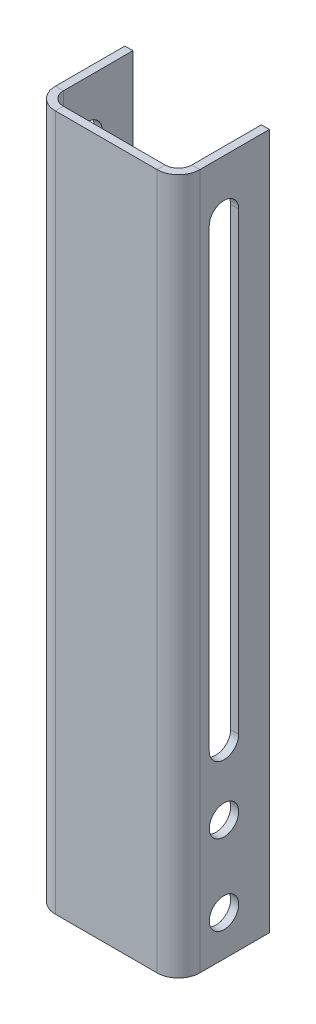
ISO-10303-21;
HEADER;
FILE_DESCRIPTION(('STEP AP214'),'2;1');
FILE_NAME('part.step','',(''),(''),'','','');
FILE_SCHEMA(('AUTOMOTIVE_DESIGN { 1 0 10303 214 1 1 1 1 }'));
ENDSEC;
DATA;
#1=APPLICATION_CONTEXT('core data for automotive mechanical design processes');
#2=APPLICATION_PROTOCOL_DEFINITION('international standard','automotive_design',2000,#1);
#3=PRODUCT_CONTEXT('',#1,'mechanical');
#4=PRODUCT('Part','Part','',(#3));
#5=PRODUCT_RELATED_PRODUCT_CATEGORY('part','',(#4));
#6=PRODUCT_DEFINITION_FORMATION('','',#4);
#7=PRODUCT_DEFINITION_CONTEXT('part definition',#1,'design');
#8=PRODUCT_DEFINITION('design','',#6,#7);
#9=PRODUCT_DEFINITION_SHAPE('','',#8);
#10=(LENGTH_UNIT() NAMED_UNIT(*) SI_UNIT(.MILLI.,.METRE.));
#11=(NAMED_UNIT(*) PLANE_ANGLE_UNIT() SI_UNIT($,.RADIAN.));
#12=(NAMED_UNIT(*) SI_UNIT($,.STERADIAN.) SOLID_ANGLE_UNIT());
#13=UNCERTAINTY_MEASURE_WITH_UNIT(LENGTH_MEASURE(1.E-05),#10,'distance_accuracy_value','');
#14=(GEOMETRIC_REPRESENTATION_CONTEXT(3) GLOBAL_UNCERTAINTY_ASSIGNED_CONTEXT((#13)) GLOBAL_UNIT_ASSIGNED_CONTEXT((#10,
#11,#12)) REPRESENTATION_CONTEXT('',''));
#15=CARTESIAN_POINT('',(0.,0.,0.));
#16=DIRECTION('',(0.,0.,1.));
#17=DIRECTION('',(1.,0.,0.));
#18=AXIS2_PLACEMENT_3D('',#15,#16,#17);
#19=CARTESIAN_POINT('',(0.,0.,-3.));
#20=DIRECTION('',(0.,0.,-1.));
#21=DIRECTION('',(-1.,0.,0.));
#22=AXIS2_PLACEMENT_3D('',#19,#20,#21);
#23=PLANE('',#22);
#24=DIRECTION('',(1.,0.,0.));
#25=VECTOR('',#24,1.);
#26=CARTESIAN_POINT('',(-27.,-130.,-3.));
#27=LINE('',#26,#25);
#28=CARTESIAN_POINT('',(-19.,-130.,-3.));
#29=VERTEX_POINT('',#28);
#30=CARTESIAN_POINT('',(19.,-130.,-3.));
#31=VERTEX_POINT('',#30);
#32=EDGE_CURVE('E392',#29,#31,#27,.T.);
#33=ORIENTED_EDGE('',*,*,#32,.F.);
#34=DIRECTION('',(0.,1.,0.));
#35=VECTOR('',#34,1.);
#36=CARTESIAN_POINT('',(-19.,130.,-3.));
#37=LINE('',#36,#35);
#38=CARTESIAN_POINT('',(-19.,130.,-3.));
#39=VERTEX_POINT('',#38);
#40=EDGE_CURVE('E324',#39,#29,#37,.F.);
#41=ORIENTED_EDGE('',*,*,#40,.F.);
#42=DIRECTION('',(-1.,0.,0.));
#43=VECTOR('',#42,1.);
#44=CARTESIAN_POINT('',(-27.,130.,-3.));
#45=LINE('',#44,#43);
#46=CARTESIAN_POINT('',(19.,130.,-3.));
#47=VERTEX_POINT('',#46);
#48=EDGE_CURVE('E389',#47,#39,#45,.T.);
#49=ORIENTED_EDGE('',*,*,#48,.F.);
#50=DIRECTION('',(0.,-1.,0.));
#51=VECTOR('',#50,1.);
#52=CARTESIAN_POINT('',(19.,-130.,-3.));
#53=LINE('',#52,#51);
#54=EDGE_CURVE('E379',#31,#47,#53,.F.);
#55=ORIENTED_EDGE('',*,*,#54,.F.);
#56=EDGE_LOOP('',(#33,#41,#49,#55));
#57=FACE_BOUND('',#56,.T.);
#58=ADVANCED_FACE('F78',(#57),#23,.T.);
#59=CARTESIAN_POINT('',(0.,0.,0.));
#60=DIRECTION('',(0.,0.,-1.));
#61=DIRECTION('',(-1.,0.,0.));
#62=AXIS2_PLACEMENT_3D('',#59,#60,#61);
#63=PLANE('',#62);
#64=DIRECTION('',(0.,1.,0.));
#65=VECTOR('',#64,1.);
#66=CARTESIAN_POINT('',(-19.,130.,0.));
#67=LINE('',#66,#65);
#68=CARTESIAN_POINT('',(-19.,130.,0.));
#69=VERTEX_POINT('',#68);
#70=CARTESIAN_POINT('',(-19.,-130.,0.));
#71=VERTEX_POINT('',#70);
#72=EDGE_CURVE('E312',#69,#71,#67,.F.);
#73=ORIENTED_EDGE('',*,*,#72,.T.);
#74=DIRECTION('',(1.,0.,0.));
#75=VECTOR('',#74,1.);
#76=CARTESIAN_POINT('',(-27.,-130.,0.));
#77=LINE('',#76,#75);
#78=CARTESIAN_POINT('',(19.,-130.,0.));
#79=VERTEX_POINT('',#78);
#80=EDGE_CURVE('E393',#71,#79,#77,.T.);
#81=ORIENTED_EDGE('',*,*,#80,.T.);
#82=DIRECTION('',(0.,-1.,0.));
#83=VECTOR('',#82,1.);
#84=CARTESIAN_POINT('',(19.,-130.,0.));
#85=LINE('',#84,#83);
#86=CARTESIAN_POINT('',(19.,130.,0.));
#87=VERTEX_POINT('',#86);
#88=EDGE_CURVE('E367',#79,#87,#85,.F.);
#89=ORIENTED_EDGE('',*,*,#88,.T.);
#90=DIRECTION('',(-1.,0.,0.));
#91=VECTOR('',#90,1.);
#92=CARTESIAN_POINT('',(-27.,130.,0.));
#93=LINE('',#92,#91);
#94=EDGE_CURVE('E387',#87,#69,#93,.T.);
#95=ORIENTED_EDGE('',*,*,#94,.T.);
#96=EDGE_LOOP('',(#73,#81,#89,#95));
#97=FACE_BOUND('',#96,.T.);
#98=ADVANCED_FACE('F476',(#97),#63,.F.);
#99=CARTESIAN_POINT('',(-27.,130.,-3.));
#100=DIRECTION('',(0.,1.,0.));
#101=DIRECTION('',(0.,0.,1.));
#102=AXIS2_PLACEMENT_3D('',#99,#100,#101);
#103=PLANE('',#102);
#104=ORIENTED_EDGE('',*,*,#48,.T.);
#105=DIRECTION('',(0.,0.,1.));
#106=VECTOR('',#105,1.);
#107=CARTESIAN_POINT('',(-19.,130.,-3.));
#108=LINE('',#107,#106);
#109=EDGE_CURVE('E318',#39,#69,#108,.T.);
#110=ORIENTED_EDGE('',*,*,#109,.T.);
#111=ORIENTED_EDGE('',*,*,#94,.F.);
#112=DIRECTION('',(0.,0.,1.));
#113=VECTOR('',#112,1.);
#114=CARTESIAN_POINT('',(19.,130.,-3.));
#115=LINE('',#114,#113);
#116=EDGE_CURVE('E384',#47,#87,#115,.T.);
#117=ORIENTED_EDGE('',*,*,#116,.F.);
#118=EDGE_LOOP('',(#104,#110,#111,#117));
#119=FACE_BOUND('',#118,.T.);
#120=ADVANCED_FACE('F80',(#119),#103,.T.);
#121=CARTESIAN_POINT('',(-27.,-130.,-3.));
#122=DIRECTION('',(0.,-1.,0.));
#123=DIRECTION('',(0.,0.,-1.));
#124=AXIS2_PLACEMENT_3D('',#121,#122,#123);
#125=PLANE('',#124);
#126=DIRECTION('',(0.,0.,1.));
#127=VECTOR('',#126,1.);
#128=CARTESIAN_POINT('',(-19.,-130.,-3.));
#129=LINE('',#128,#127);
#130=EDGE_CURVE('E329',#29,#71,#129,.T.);
#131=ORIENTED_EDGE('',*,*,#130,.F.);
#132=ORIENTED_EDGE('',*,*,#32,.T.);
#133=DIRECTION('',(0.,0.,1.));
#134=VECTOR('',#133,1.);
#135=CARTESIAN_POINT('',(19.,-130.,-3.));
#136=LINE('',#135,#134);
#137=EDGE_CURVE('E373',#31,#79,#136,.T.);
#138=ORIENTED_EDGE('',*,*,#137,.T.);
#139=ORIENTED_EDGE('',*,*,#80,.F.);
#140=EDGE_LOOP('',(#131,#132,#138,#139));
#141=FACE_BOUND('',#140,.T.);
#142=ADVANCED_FACE('F531',(#141),#125,.T.);
#143=CARTESIAN_POINT('',(19.,130.,-8.));
#144=DIRECTION('',(0.,1.,0.));
#145=DIRECTION('',(0.,0.,1.));
#146=AXIS2_PLACEMENT_3D('',#143,#144,#145);
#147=PLANE('',#146);
#148=DIRECTION('',(1.,0.,0.));
#149=VECTOR('',#148,1.);
#150=CARTESIAN_POINT('',(27.,130.,-7.99999999999997));
#151=LINE('',#150,#149);
#152=CARTESIAN_POINT('',(24.,130.,-7.99999999999998));
#153=VERTEX_POINT('',#152);
#154=CARTESIAN_POINT('',(27.,130.,-7.99999999999997));
#155=VERTEX_POINT('',#154);
#156=EDGE_CURVE('E332',#153,#155,#151,.T.);
#157=ORIENTED_EDGE('',*,*,#156,.F.);
#158=CARTESIAN_POINT('',(19.,130.,-8.));
#159=DIRECTION('',(0.,-1.,0.));
#160=DIRECTION('',(0.,0.,-1.));
#161=AXIS2_PLACEMENT_3D('',#158,#159,#160);
#162=CIRCLE('',#161,5.);
#163=EDGE_CURVE('E376',#47,#153,#162,.F.);
#164=ORIENTED_EDGE('',*,*,#163,.F.);
#165=ORIENTED_EDGE('',*,*,#116,.T.);
#166=CARTESIAN_POINT('',(19.,130.,-8.));
#167=DIRECTION('',(0.,-1.,0.));
#168=DIRECTION('',(0.,0.,-1.));
#169=AXIS2_PLACEMENT_3D('',#166,#167,#168);
#170=CIRCLE('',#169,8.);
#171=EDGE_CURVE('E369',#87,#155,#170,.F.);
#172=ORIENTED_EDGE('',*,*,#171,.T.);
#173=EDGE_LOOP('',(#157,#164,#165,#172));
#174=FACE_BOUND('',#173,.T.);
#175=ADVANCED_FACE('F469',(#174),#147,.T.);
#176=CARTESIAN_POINT('',(19.,-130.,-8.));
#177=DIRECTION('',(0.,1.,0.));
#178=DIRECTION('',(0.,0.,1.));
#179=AXIS2_PLACEMENT_3D('',#176,#177,#178);
#180=PLANE('',#179);
#181=CARTESIAN_POINT('',(19.,-130.,-8.));
#182=DIRECTION('',(0.,-1.,0.));
#183=DIRECTION('',(0.,0.,-1.));
#184=AXIS2_PLACEMENT_3D('',#181,#182,#183);
#185=CIRCLE('',#184,5.);
#186=CARTESIAN_POINT('',(24.,-130.,-7.99999999999998));
#187=VERTEX_POINT('',#186);
#188=EDGE_CURVE('E337',#187,#31,#185,.T.);
#189=ORIENTED_EDGE('',*,*,#188,.F.);
#190=DIRECTION('',(1.,0.,0.));
#191=VECTOR('',#190,1.);
#192=CARTESIAN_POINT('',(24.,-130.,-7.99999999999999));
#193=LINE('',#192,#191);
#194=CARTESIAN_POINT('',(27.,-130.,-7.99999999999998));
#195=VERTEX_POINT('',#194);
#196=EDGE_CURVE('E360',#187,#195,#193,.T.);
#197=ORIENTED_EDGE('',*,*,#196,.T.);
#198=CARTESIAN_POINT('',(19.,-130.,-8.));
#199=DIRECTION('',(0.,-1.,0.));
#200=DIRECTION('',(0.,0.,-1.));
#201=AXIS2_PLACEMENT_3D('',#198,#199,#200);
#202=CIRCLE('',#201,8.);
#203=EDGE_CURVE('E370',#195,#79,#202,.T.);
#204=ORIENTED_EDGE('',*,*,#203,.T.);
#205=ORIENTED_EDGE('',*,*,#137,.F.);
#206=EDGE_LOOP('',(#189,#197,#204,#205));
#207=FACE_BOUND('',#206,.T.);
#208=ADVANCED_FACE('F462',(#207),#180,.F.);
#209=CARTESIAN_POINT('',(19.,-130.,-8.));
#210=DIRECTION('',(0.,-1.,0.));
#211=DIRECTION('',(1.,0.,0.));
#212=AXIS2_PLACEMENT_3D('',#209,#210,#211);
#213=CYLINDRICAL_SURFACE('',#212,8.);
#214=ORIENTED_EDGE('',*,*,#88,.F.);
#215=ORIENTED_EDGE('',*,*,#203,.F.);
#216=DIRECTION('',(0.,-1.,0.));
#217=VECTOR('',#216,1.);
#218=CARTESIAN_POINT('',(27.,0.,-7.99999999999997));
#219=LINE('',#218,#217);
#220=EDGE_CURVE('E357',#155,#195,#219,.T.);
#221=ORIENTED_EDGE('',*,*,#220,.F.);
#222=ORIENTED_EDGE('',*,*,#171,.F.);
#223=EDGE_LOOP('',(#214,#215,#221,#222));
#224=FACE_BOUND('',#223,.T.);
#225=ADVANCED_FACE('F473',(#224),#213,.T.);
#226=CARTESIAN_POINT('',(19.,-130.,-8.));
#227=DIRECTION('',(0.,-1.,0.));
#228=DIRECTION('',(1.,0.,0.));
#229=AXIS2_PLACEMENT_3D('',#226,#227,#228);
#230=CYLINDRICAL_SURFACE('',#229,5.);
#231=ORIENTED_EDGE('',*,*,#54,.T.);
#232=ORIENTED_EDGE('',*,*,#163,.T.);
#233=DIRECTION('',(0.,1.,0.));
#234=VECTOR('',#233,1.);
#235=CARTESIAN_POINT('',(24.,130.,-7.99999999999998));
#236=LINE('',#235,#234);
#237=EDGE_CURVE('E363',#153,#187,#236,.F.);
#238=ORIENTED_EDGE('',*,*,#237,.T.);
#239=ORIENTED_EDGE('',*,*,#188,.T.);
#240=EDGE_LOOP('',(#231,#232,#238,#239));
#241=FACE_BOUND('',#240,.T.);
#242=ADVANCED_FACE('F465',(#241),#230,.F.);
#243=CARTESIAN_POINT('',(27.,-130.,-2.99999999999999));
#244=DIRECTION('',(0.,-1.,0.));
#245=DIRECTION('',(0.,0.,-1.));
#246=AXIS2_PLACEMENT_3D('',#243,#244,#245);
#247=PLANE('',#246);
#248=DIRECTION('',(0.,0.,1.));
#249=VECTOR('',#248,1.);
#250=CARTESIAN_POINT('',(27.,-130.,-2.99999999999999));
#251=LINE('',#250,#249);
#252=CARTESIAN_POINT('',(27.0000000000001,-130.,-34.));
#253=VERTEX_POINT('',#252);
#254=EDGE_CURVE('E341',#253,#195,#251,.T.);
#255=ORIENTED_EDGE('',*,*,#254,.T.);
#256=ORIENTED_EDGE('',*,*,#196,.F.);
#257=DIRECTION('',(0.,0.,-1.));
#258=VECTOR('',#257,1.);
#259=CARTESIAN_POINT('',(24.,-130.,0.));
#260=LINE('',#259,#258);
#261=CARTESIAN_POINT('',(24.0000000000001,-130.,-34.));
#262=VERTEX_POINT('',#261);
#263=EDGE_CURVE('E349',#262,#187,#260,.F.);
#264=ORIENTED_EDGE('',*,*,#263,.F.);
#265=DIRECTION('',(-1.,0.,0.));
#266=VECTOR('',#265,1.);
#267=CARTESIAN_POINT('',(27.0000000000001,-130.,-34.));
#268=LINE('',#267,#266);
#269=EDGE_CURVE('E335',#253,#262,#268,.T.);
#270=ORIENTED_EDGE('',*,*,#269,.F.);
#271=EDGE_LOOP('',(#255,#256,#264,#270));
#272=FACE_BOUND('',#271,.T.);
#273=ADVANCED_FACE('F459',(#272),#247,.T.);
#274=CARTESIAN_POINT('',(27.0000000000001,130.,-34.));
#275=DIRECTION('',(0.,1.,0.));
#276=DIRECTION('',(0.,0.,1.));
#277=AXIS2_PLACEMENT_3D('',#274,#275,#276);
#278=PLANE('',#277);
#279=DIRECTION('',(0.,0.,1.));
#280=VECTOR('',#279,1.);
#281=CARTESIAN_POINT('',(24.,130.,0.));
#282=LINE('',#281,#280);
#283=CARTESIAN_POINT('',(24.0000000000001,130.,-34.));
#284=VERTEX_POINT('',#283);
#285=EDGE_CURVE('E355',#153,#284,#282,.F.);
#286=ORIENTED_EDGE('',*,*,#285,.F.);
#287=ORIENTED_EDGE('',*,*,#156,.T.);
#288=DIRECTION('',(0.,0.,-1.));
#289=VECTOR('',#288,1.);
#290=CARTESIAN_POINT('',(27.0000000000001,130.,-34.));
#291=LINE('',#290,#289);
#292=CARTESIAN_POINT('',(27.0000000000001,130.,-34.));
#293=VERTEX_POINT('',#292);
#294=EDGE_CURVE('E347',#155,#293,#291,.T.);
#295=ORIENTED_EDGE('',*,*,#294,.T.);
#296=DIRECTION('',(-1.,0.,0.));
#297=VECTOR('',#296,1.);
#298=CARTESIAN_POINT('',(27.0000000000001,130.,-34.));
#299=LINE('',#298,#297);
#300=EDGE_CURVE('E338',#293,#284,#299,.T.);
#301=ORIENTED_EDGE('',*,*,#300,.T.);
#302=EDGE_LOOP('',(#286,#287,#295,#301));
#303=FACE_BOUND('',#302,.T.);
#304=ADVANCED_FACE('F439',(#303),#278,.T.);
#305=CARTESIAN_POINT('',(27.,0.,1.04149511719277E-13));
#306=DIRECTION('',(1.,0.,0.));
#307=DIRECTION('',(0.,0.,-1.));
#308=AXIS2_PLACEMENT_3D('',#305,#306,#307);
#309=PLANE('',#308);
#310=CARTESIAN_POINT('',(27.,-115.,-17.));
#311=DIRECTION('',(1.,0.,0.));
#312=DIRECTION('',(0.,0.,-1.));
#313=AXIS2_PLACEMENT_3D('',#310,#311,#312);
#314=CIRCLE('',#313,5.5);
#315=CARTESIAN_POINT('',(27.0000000000001,-115.,-22.5));
#316=VERTEX_POINT('',#315);
#317=EDGE_CURVE('E416',#316,#316,#314,.T.);
#318=ORIENTED_EDGE('',*,*,#317,.F.);
#319=EDGE_LOOP('',(#318));
#320=FACE_BOUND('',#319,.T.);
#321=CARTESIAN_POINT('',(27.,-85.,-17.));
#322=DIRECTION('',(1.,0.,0.));
#323=DIRECTION('',(0.,0.,-1.));
#324=AXIS2_PLACEMENT_3D('',#321,#322,#323);
#325=CIRCLE('',#324,5.5);
#326=CARTESIAN_POINT('',(27.0000000000001,-85.,-22.5));
#327=VERTEX_POINT('',#326);
#328=EDGE_CURVE('E428',#327,#327,#325,.T.);
#329=ORIENTED_EDGE('',*,*,#328,.F.);
#330=EDGE_LOOP('',(#329));
#331=FACE_BOUND('',#330,.T.);
#332=CARTESIAN_POINT('',(27.,-60.,-16.9999999999999));
#333=DIRECTION('',(1.,0.,0.));
#334=DIRECTION('',(0.,0.,-1.));
#335=AXIS2_PLACEMENT_3D('',#332,#333,#334);
#336=CIRCLE('',#335,5.5);
#337=CARTESIAN_POINT('',(27.,-60.,-11.4999999999999));
#338=VERTEX_POINT('',#337);
#339=CARTESIAN_POINT('',(27.0000000000001,-60.,-22.4999999999999));
#340=VERTEX_POINT('',#339);
#341=EDGE_CURVE('E95',#338,#340,#336,.T.);
#342=ORIENTED_EDGE('',*,*,#341,.F.);
#343=DIRECTION('',(0.,-1.,0.));
#344=VECTOR('',#343,1.);
#345=CARTESIAN_POINT('',(27.,-60.,-11.4999999999999));
#346=LINE('',#345,#344);
#347=CARTESIAN_POINT('',(27.,110.,-11.4999999999999));
#348=VERTEX_POINT('',#347);
#349=EDGE_CURVE('E243',#348,#338,#346,.T.);
#350=ORIENTED_EDGE('',*,*,#349,.F.);
#351=CARTESIAN_POINT('',(27.,110.,-17.));
#352=DIRECTION('',(1.,0.,0.));
#353=DIRECTION('',(0.,0.,-1.));
#354=AXIS2_PLACEMENT_3D('',#351,#352,#353);
#355=CIRCLE('',#354,5.5);
#356=CARTESIAN_POINT('',(27.0000000000001,110.,-22.5));
#357=VERTEX_POINT('',#356);
#358=EDGE_CURVE('E246',#357,#348,#355,.T.);
#359=ORIENTED_EDGE('',*,*,#358,.F.);
#360=DIRECTION('',(0.,1.,0.));
#361=VECTOR('',#360,1.);
#362=CARTESIAN_POINT('',(27.0000000000001,-60.,-22.4999999999999));
#363=LINE('',#362,#361);
#364=EDGE_CURVE('E255',#340,#357,#363,.T.);
#365=ORIENTED_EDGE('',*,*,#364,.F.);
#366=EDGE_LOOP('',(#342,#350,#359,#365));
#367=FACE_BOUND('',#366,.T.);
#368=ORIENTED_EDGE('',*,*,#294,.F.);
#369=ORIENTED_EDGE('',*,*,#220,.T.);
#370=ORIENTED_EDGE('',*,*,#254,.F.);
#371=DIRECTION('',(0.,-1.,0.));
#372=VECTOR('',#371,1.);
#373=CARTESIAN_POINT('',(27.0000000000001,-130.,-34.));
#374=LINE('',#373,#372);
#375=EDGE_CURVE('E344',#293,#253,#374,.T.);
#376=ORIENTED_EDGE('',*,*,#375,.F.);
#377=EDGE_LOOP('',(#368,#369,#370,#376));
#378=FACE_BOUND('',#377,.T.);
#379=ADVANCED_FACE('F435',(#320,#331,#367,#378),#309,.T.);
#380=CARTESIAN_POINT('',(24.,0.,0.));
#381=DIRECTION('',(1.,0.,0.));
#382=DIRECTION('',(0.,0.,-1.));
#383=AXIS2_PLACEMENT_3D('',#380,#381,#382);
#384=PLANE('',#383);
#385=CARTESIAN_POINT('',(24.0000000000001,-115.,-17.));
#386=DIRECTION('',(1.,0.,0.));
#387=DIRECTION('',(0.,0.,-1.));
#388=AXIS2_PLACEMENT_3D('',#385,#386,#387);
#389=CIRCLE('',#388,5.5);
#390=CARTESIAN_POINT('',(24.0000000000001,-115.,-22.5));
#391=VERTEX_POINT('',#390);
#392=EDGE_CURVE('E249',#391,#391,#389,.T.);
#393=ORIENTED_EDGE('',*,*,#392,.T.);
#394=EDGE_LOOP('',(#393));
#395=FACE_BOUND('',#394,.T.);
#396=CARTESIAN_POINT('',(24.0000000000001,-85.,-17.));
#397=DIRECTION('',(1.,0.,0.));
#398=DIRECTION('',(0.,0.,-1.));
#399=AXIS2_PLACEMENT_3D('',#396,#397,#398);
#400=CIRCLE('',#399,5.5);
#401=CARTESIAN_POINT('',(24.0000000000001,-85.,-22.5));
#402=VERTEX_POINT('',#401);
#403=EDGE_CURVE('E407',#402,#402,#400,.T.);
#404=ORIENTED_EDGE('',*,*,#403,.T.);
#405=EDGE_LOOP('',(#404));
#406=FACE_BOUND('',#405,.T.);
#407=DIRECTION('',(0.,-1.,0.));
#408=VECTOR('',#407,1.);
#409=CARTESIAN_POINT('',(24.,0.,-11.5));
#410=LINE('',#409,#408);
#411=CARTESIAN_POINT('',(24.0000000000001,110.,-11.5));
#412=VERTEX_POINT('',#411);
#413=CARTESIAN_POINT('',(24.,-60.,-11.5));
#414=VERTEX_POINT('',#413);
#415=EDGE_CURVE('E273',#412,#414,#410,.T.);
#416=ORIENTED_EDGE('',*,*,#415,.T.);
#417=CARTESIAN_POINT('',(24.0000000000001,-60.,-17.));
#418=DIRECTION('',(1.,0.,0.));
#419=DIRECTION('',(0.,0.,-1.));
#420=AXIS2_PLACEMENT_3D('',#417,#418,#419);
#421=CIRCLE('',#420,5.5);
#422=CARTESIAN_POINT('',(24.0000000000001,-60.,-22.5));
#423=VERTEX_POINT('',#422);
#424=EDGE_CURVE('E276',#414,#423,#421,.T.);
#425=ORIENTED_EDGE('',*,*,#424,.T.);
#426=DIRECTION('',(0.,1.,0.));
#427=VECTOR('',#426,1.);
#428=CARTESIAN_POINT('',(24.0000000000001,0.,-22.5));
#429=LINE('',#428,#427);
#430=CARTESIAN_POINT('',(24.0000000000001,110.,-22.5));
#431=VERTEX_POINT('',#430);
#432=EDGE_CURVE('E261',#423,#431,#429,.T.);
#433=ORIENTED_EDGE('',*,*,#432,.T.);
#434=CARTESIAN_POINT('',(24.0000000000001,110.,-17.));
#435=DIRECTION('',(1.,0.,0.));
#436=DIRECTION('',(0.,0.,-1.));
#437=AXIS2_PLACEMENT_3D('',#434,#435,#436);
#438=CIRCLE('',#437,5.5);
#439=EDGE_CURVE('E270',#431,#412,#438,.T.);
#440=ORIENTED_EDGE('',*,*,#439,.T.);
#441=EDGE_LOOP('',(#416,#425,#433,#440));
#442=FACE_BOUND('',#441,.T.);
#443=ORIENTED_EDGE('',*,*,#237,.F.);
#444=ORIENTED_EDGE('',*,*,#285,.T.);
#445=DIRECTION('',(0.,1.,0.));
#446=VECTOR('',#445,1.);
#447=CARTESIAN_POINT('',(24.0000000000001,0.,-34.));
#448=LINE('',#447,#446);
#449=EDGE_CURVE('E352',#284,#262,#448,.F.);
#450=ORIENTED_EDGE('',*,*,#449,.T.);
#451=ORIENTED_EDGE('',*,*,#263,.T.);
#452=EDGE_LOOP('',(#443,#444,#450,#451));
#453=FACE_BOUND('',#452,.T.);
#454=ADVANCED_FACE('F438',(#395,#406,#442,#453),#384,.F.);
#455=CARTESIAN_POINT('',(27.0000000000001,-130.,-34.));
#456=DIRECTION('',(0.,0.,-1.));
#457=DIRECTION('',(-1.,0.,0.));
#458=AXIS2_PLACEMENT_3D('',#455,#456,#457);
#459=PLANE('',#458);
#460=ORIENTED_EDGE('',*,*,#449,.F.);
#461=ORIENTED_EDGE('',*,*,#300,.F.);
#462=ORIENTED_EDGE('',*,*,#375,.T.);
#463=ORIENTED_EDGE('',*,*,#269,.T.);
#464=EDGE_LOOP('',(#460,#461,#462,#463));
#465=FACE_BOUND('',#464,.T.);
#466=ADVANCED_FACE('F453',(#465),#459,.T.);
#467=CARTESIAN_POINT('',(-19.,-130.,-8.));
#468=DIRECTION('',(0.,-1.,0.));
#469=DIRECTION('',(0.,0.,-1.));
#470=AXIS2_PLACEMENT_3D('',#467,#468,#469);
#471=PLANE('',#470);
#472=DIRECTION('',(-1.,0.,0.));
#473=VECTOR('',#472,1.);
#474=CARTESIAN_POINT('',(-27.,-130.,-7.99999999999997));
#475=LINE('',#474,#473);
#476=CARTESIAN_POINT('',(-24.,-130.,-7.99999999999998));
#477=VERTEX_POINT('',#476);
#478=CARTESIAN_POINT('',(-27.,-130.,-7.99999999999997));
#479=VERTEX_POINT('',#478);
#480=EDGE_CURVE('E279',#477,#479,#475,.T.);
#481=ORIENTED_EDGE('',*,*,#480,.F.);
#482=CARTESIAN_POINT('',(-19.,-130.,-8.));
#483=DIRECTION('',(0.,1.,0.));
#484=DIRECTION('',(0.,0.,1.));
#485=AXIS2_PLACEMENT_3D('',#482,#483,#484);
#486=CIRCLE('',#485,5.);
#487=EDGE_CURVE('E321',#29,#477,#486,.F.);
#488=ORIENTED_EDGE('',*,*,#487,.F.);
#489=ORIENTED_EDGE('',*,*,#130,.T.);
#490=CARTESIAN_POINT('',(-19.,-130.,-8.));
#491=DIRECTION('',(0.,1.,0.));
#492=DIRECTION('',(0.,0.,1.));
#493=AXIS2_PLACEMENT_3D('',#490,#491,#492);
#494=CIRCLE('',#493,8.);
#495=EDGE_CURVE('E314',#71,#479,#494,.F.);
#496=ORIENTED_EDGE('',*,*,#495,.T.);
#497=EDGE_LOOP('',(#481,#488,#489,#496));
#498=FACE_BOUND('',#497,.T.);
#499=ADVANCED_FACE('F504',(#498),#471,.T.);
#500=CARTESIAN_POINT('',(-19.,130.,-8.));
#501=DIRECTION('',(0.,-1.,0.));
#502=DIRECTION('',(0.,0.,-1.));
#503=AXIS2_PLACEMENT_3D('',#500,#501,#502);
#504=PLANE('',#503);
#505=CARTESIAN_POINT('',(-19.,130.,-8.));
#506=DIRECTION('',(0.,1.,0.));
#507=DIRECTION('',(0.,0.,1.));
#508=AXIS2_PLACEMENT_3D('',#505,#506,#507);
#509=CIRCLE('',#508,5.);
#510=CARTESIAN_POINT('',(-24.,130.,-7.99999999999998));
#511=VERTEX_POINT('',#510);
#512=EDGE_CURVE('E282',#511,#39,#509,.T.);
#513=ORIENTED_EDGE('',*,*,#512,.F.);
#514=DIRECTION('',(-1.,0.,0.));
#515=VECTOR('',#514,1.);
#516=CARTESIAN_POINT('',(-24.,130.,-7.99999999999998));
#517=LINE('',#516,#515);
#518=CARTESIAN_POINT('',(-27.,130.,-7.99999999999997));
#519=VERTEX_POINT('',#518);
#520=EDGE_CURVE('E305',#511,#519,#517,.T.);
#521=ORIENTED_EDGE('',*,*,#520,.T.);
#522=CARTESIAN_POINT('',(-19.,130.,-8.));
#523=DIRECTION('',(0.,1.,0.));
#524=DIRECTION('',(0.,0.,1.));
#525=AXIS2_PLACEMENT_3D('',#522,#523,#524);
#526=CIRCLE('',#525,8.);
#527=EDGE_CURVE('E315',#519,#69,#526,.T.);
#528=ORIENTED_EDGE('',*,*,#527,.T.);
#529=ORIENTED_EDGE('',*,*,#109,.F.);
#530=EDGE_LOOP('',(#513,#521,#528,#529));
#531=FACE_BOUND('',#530,.T.);
#532=ADVANCED_FACE('F487',(#531),#504,.F.);
#533=CARTESIAN_POINT('',(-19.,130.,-8.));
#534=DIRECTION('',(0.,1.,0.));
#535=DIRECTION('',(-1.,0.,0.));
#536=AXIS2_PLACEMENT_3D('',#533,#534,#535);
#537=CYLINDRICAL_SURFACE('',#536,8.);
#538=ORIENTED_EDGE('',*,*,#72,.F.);
#539=ORIENTED_EDGE('',*,*,#527,.F.);
#540=DIRECTION('',(0.,1.,0.));
#541=VECTOR('',#540,1.);
#542=CARTESIAN_POINT('',(-27.,0.,-7.99999999999997));
#543=LINE('',#542,#541);
#544=EDGE_CURVE('E302',#479,#519,#543,.T.);
#545=ORIENTED_EDGE('',*,*,#544,.F.);
#546=ORIENTED_EDGE('',*,*,#495,.F.);
#547=EDGE_LOOP('',(#538,#539,#545,#546));
#548=FACE_BOUND('',#547,.T.);
#549=ADVANCED_FACE('F486',(#548),#537,.T.);
#550=CARTESIAN_POINT('',(-19.,130.,-8.));
#551=DIRECTION('',(0.,1.,0.));
#552=DIRECTION('',(-1.,0.,0.));
#553=AXIS2_PLACEMENT_3D('',#550,#551,#552);
#554=CYLINDRICAL_SURFACE('',#553,5.);
#555=ORIENTED_EDGE('',*,*,#40,.T.);
#556=ORIENTED_EDGE('',*,*,#487,.T.);
#557=DIRECTION('',(0.,-1.,0.));
#558=VECTOR('',#557,1.);
#559=CARTESIAN_POINT('',(-24.,-130.,-7.99999999999998));
#560=LINE('',#559,#558);
#561=EDGE_CURVE('E308',#477,#511,#560,.F.);
#562=ORIENTED_EDGE('',*,*,#561,.T.);
#563=ORIENTED_EDGE('',*,*,#512,.T.);
#564=EDGE_LOOP('',(#555,#556,#562,#563));
#565=FACE_BOUND('',#564,.T.);
#566=ADVANCED_FACE('F507',(#565),#554,.F.);
#567=CARTESIAN_POINT('',(-27.,130.,-2.99999999999999));
#568=DIRECTION('',(0.,1.,0.));
#569=DIRECTION('',(0.,0.,1.));
#570=AXIS2_PLACEMENT_3D('',#567,#568,#569);
#571=PLANE('',#570);
#572=DIRECTION('',(0.,0.,1.));
#573=VECTOR('',#572,1.);
#574=CARTESIAN_POINT('',(-27.,130.,-2.99999999999999));
#575=LINE('',#574,#573);
#576=CARTESIAN_POINT('',(-27.0000000000001,130.,-34.));
#577=VERTEX_POINT('',#576);
#578=EDGE_CURVE('E286',#577,#519,#575,.T.);
#579=ORIENTED_EDGE('',*,*,#578,.T.);
#580=ORIENTED_EDGE('',*,*,#520,.F.);
#581=DIRECTION('',(0.,0.,-1.));
#582=VECTOR('',#581,1.);
#583=CARTESIAN_POINT('',(-24.,130.,0.));
#584=LINE('',#583,#582);
#585=CARTESIAN_POINT('',(-24.0000000000001,130.,-34.));
#586=VERTEX_POINT('',#585);
#587=EDGE_CURVE('E294',#586,#511,#584,.F.);
#588=ORIENTED_EDGE('',*,*,#587,.F.);
#589=DIRECTION('',(1.,0.,0.));
#590=VECTOR('',#589,1.);
#591=CARTESIAN_POINT('',(-27.0000000000001,130.,-34.));
#592=LINE('',#591,#590);
#593=EDGE_CURVE('E280',#577,#586,#592,.T.);
#594=ORIENTED_EDGE('',*,*,#593,.F.);
#595=EDGE_LOOP('',(#579,#580,#588,#594));
#596=FACE_BOUND('',#595,.T.);
#597=ADVANCED_FACE('F494',(#596),#571,.T.);
#598=CARTESIAN_POINT('',(-27.0000000000001,-130.,-34.));
#599=DIRECTION('',(0.,-1.,0.));
#600=DIRECTION('',(0.,0.,-1.));
#601=AXIS2_PLACEMENT_3D('',#598,#599,#600);
#602=PLANE('',#601);
#603=DIRECTION('',(0.,0.,1.));
#604=VECTOR('',#603,1.);
#605=CARTESIAN_POINT('',(-24.,-130.,0.));
#606=LINE('',#605,#604);
#607=CARTESIAN_POINT('',(-24.0000000000001,-130.,-34.));
#608=VERTEX_POINT('',#607);
#609=EDGE_CURVE('E300',#477,#608,#606,.F.);
#610=ORIENTED_EDGE('',*,*,#609,.F.);
#611=ORIENTED_EDGE('',*,*,#480,.T.);
#612=DIRECTION('',(0.,0.,-1.));
#613=VECTOR('',#612,1.);
#614=CARTESIAN_POINT('',(-27.0000000000001,-130.,-34.));
#615=LINE('',#614,#613);
#616=CARTESIAN_POINT('',(-27.0000000000001,-130.,-34.));
#617=VERTEX_POINT('',#616);
#618=EDGE_CURVE('E292',#479,#617,#615,.T.);
#619=ORIENTED_EDGE('',*,*,#618,.T.);
#620=DIRECTION('',(1.,0.,0.));
#621=VECTOR('',#620,1.);
#622=CARTESIAN_POINT('',(-27.0000000000001,-130.,-34.));
#623=LINE('',#622,#621);
#624=EDGE_CURVE('E283',#617,#608,#623,.T.);
#625=ORIENTED_EDGE('',*,*,#624,.T.);
#626=EDGE_LOOP('',(#610,#611,#619,#625));
#627=FACE_BOUND('',#626,.T.);
#628=ADVANCED_FACE('F501',(#627),#602,.T.);
#629=CARTESIAN_POINT('',(-27.,0.,1.04149511719277E-13));
#630=DIRECTION('',(-1.,0.,0.));
#631=DIRECTION('',(0.,0.,1.));
#632=AXIS2_PLACEMENT_3D('',#629,#630,#631);
#633=PLANE('',#632);
#634=CARTESIAN_POINT('',(-27.0000000000002,-115.,-17.0000000000002));
#635=DIRECTION('',(1.,0.,0.));
#636=DIRECTION('',(0.,0.,-1.));
#637=AXIS2_PLACEMENT_3D('',#634,#635,#636);
#638=CIRCLE('',#637,5.5);
#639=CARTESIAN_POINT('',(-27.0000000000002,-115.,-22.5000000000002));
#640=VERTEX_POINT('',#639);
#641=EDGE_CURVE('E408',#640,#640,#638,.T.);
#642=ORIENTED_EDGE('',*,*,#641,.T.);
#643=EDGE_LOOP('',(#642));
#644=FACE_BOUND('',#643,.T.);
#645=CARTESIAN_POINT('',(-27.0000000000002,-85.,-17.0000000000002));
#646=DIRECTION('',(1.,0.,0.));
#647=DIRECTION('',(0.,0.,-1.));
#648=AXIS2_PLACEMENT_3D('',#645,#646,#647);
#649=CIRCLE('',#648,5.5);
#650=CARTESIAN_POINT('',(-27.0000000000002,-85.,-22.5000000000002));
#651=VERTEX_POINT('',#650);
#652=EDGE_CURVE('E423',#651,#651,#649,.T.);
#653=ORIENTED_EDGE('',*,*,#652,.T.);
#654=EDGE_LOOP('',(#653));
#655=FACE_BOUND('',#654,.T.);
#656=CARTESIAN_POINT('',(-27.0000000000002,-60.,-17.0000000000001));
#657=DIRECTION('',(1.,0.,0.));
#658=DIRECTION('',(0.,0.,-1.));
#659=AXIS2_PLACEMENT_3D('',#656,#657,#658);
#660=CIRCLE('',#659,5.5);
#661=CARTESIAN_POINT('',(-27.0000000000002,-60.,-11.5000000000001));
#662=VERTEX_POINT('',#661);
#663=CARTESIAN_POINT('',(-27.0000000000001,-60.,-22.5000000000001));
#664=VERTEX_POINT('',#663);
#665=EDGE_CURVE('E223',#662,#664,#660,.T.);
#666=ORIENTED_EDGE('',*,*,#665,.T.);
#667=DIRECTION('',(0.,1.,0.));
#668=VECTOR('',#667,1.);
#669=CARTESIAN_POINT('',(-27.0000000000001,-60.,-22.5000000000001));
#670=LINE('',#669,#668);
#671=CARTESIAN_POINT('',(-27.0000000000001,110.,-22.5000000000001));
#672=VERTEX_POINT('',#671);
#673=EDGE_CURVE('E231',#664,#672,#670,.T.);
#674=ORIENTED_EDGE('',*,*,#673,.T.);
#675=CARTESIAN_POINT('',(-27.0000000000002,110.,-17.0000000000001));
#676=DIRECTION('',(1.,0.,0.));
#677=DIRECTION('',(0.,0.,-1.));
#678=AXIS2_PLACEMENT_3D('',#675,#676,#677);
#679=CIRCLE('',#678,5.5);
#680=CARTESIAN_POINT('',(-27.0000000000002,110.,-11.5000000000001));
#681=VERTEX_POINT('',#680);
#682=EDGE_CURVE('E237',#672,#681,#679,.T.);
#683=ORIENTED_EDGE('',*,*,#682,.T.);
#684=DIRECTION('',(0.,-1.,0.));
#685=VECTOR('',#684,1.);
#686=CARTESIAN_POINT('',(-27.0000000000002,-60.,-11.5000000000001));
#687=LINE('',#686,#685);
#688=EDGE_CURVE('E242',#681,#662,#687,.T.);
#689=ORIENTED_EDGE('',*,*,#688,.T.);
#690=EDGE_LOOP('',(#666,#674,#683,#689));
#691=FACE_BOUND('',#690,.T.);
#692=ORIENTED_EDGE('',*,*,#618,.F.);
#693=ORIENTED_EDGE('',*,*,#544,.T.);
#694=ORIENTED_EDGE('',*,*,#578,.F.);
#695=DIRECTION('',(0.,1.,0.));
#696=VECTOR('',#695,1.);
#697=CARTESIAN_POINT('',(-27.0000000000001,130.,-34.));
#698=LINE('',#697,#696);
#699=EDGE_CURVE('E289',#617,#577,#698,.T.);
#700=ORIENTED_EDGE('',*,*,#699,.F.);
#701=EDGE_LOOP('',(#692,#693,#694,#700));
#702=FACE_BOUND('',#701,.T.);
#703=ADVANCED_FACE('F239',(#644,#655,#691,#702),#633,.T.);
#704=CARTESIAN_POINT('',(-24.,0.,0.));
#705=DIRECTION('',(-1.,0.,0.));
#706=DIRECTION('',(0.,0.,1.));
#707=AXIS2_PLACEMENT_3D('',#704,#705,#706);
#708=PLANE('',#707);
#709=CARTESIAN_POINT('',(-24.,-115.,-17.0000000000002));
#710=DIRECTION('',(-1.,0.,0.));
#711=DIRECTION('',(0.,0.,1.));
#712=AXIS2_PLACEMENT_3D('',#709,#710,#711);
#713=CIRCLE('',#712,5.5);
#714=CARTESIAN_POINT('',(-24.,-115.,-11.5000000000002));
#715=VERTEX_POINT('',#714);
#716=EDGE_CURVE('E82',#715,#715,#713,.T.);
#717=ORIENTED_EDGE('',*,*,#716,.T.);
#718=EDGE_LOOP('',(#717));
#719=FACE_BOUND('',#718,.T.);
#720=CARTESIAN_POINT('',(-24.,-85.,-17.0000000000002));
#721=DIRECTION('',(-1.,0.,0.));
#722=DIRECTION('',(0.,0.,1.));
#723=AXIS2_PLACEMENT_3D('',#720,#721,#722);
#724=CIRCLE('',#723,5.5);
#725=CARTESIAN_POINT('',(-24.,-85.,-11.5000000000002));
#726=VERTEX_POINT('',#725);
#727=EDGE_CURVE('E404',#726,#726,#724,.T.);
#728=ORIENTED_EDGE('',*,*,#727,.T.);
#729=EDGE_LOOP('',(#728));
#730=FACE_BOUND('',#729,.T.);
#731=DIRECTION('',(0.,-1.,0.));
#732=VECTOR('',#731,1.);
#733=CARTESIAN_POINT('',(-24.0000000000001,0.,-22.5000000000001));
#734=LINE('',#733,#732);
#735=CARTESIAN_POINT('',(-24.0000000000001,110.,-22.5000000000001));
#736=VERTEX_POINT('',#735);
#737=CARTESIAN_POINT('',(-24.0000000000001,-60.,-22.5000000000001));
#738=VERTEX_POINT('',#737);
#739=EDGE_CURVE('E395',#736,#738,#734,.T.);
#740=ORIENTED_EDGE('',*,*,#739,.T.);
#741=CARTESIAN_POINT('',(-24.,-60.,-17.0000000000001));
#742=DIRECTION('',(-1.,0.,0.));
#743=DIRECTION('',(0.,0.,1.));
#744=AXIS2_PLACEMENT_3D('',#741,#742,#743);
#745=CIRCLE('',#744,5.5);
#746=CARTESIAN_POINT('',(-24.,-60.,-11.5000000000001));
#747=VERTEX_POINT('',#746);
#748=EDGE_CURVE('E13',#738,#747,#745,.T.);
#749=ORIENTED_EDGE('',*,*,#748,.T.);
#750=DIRECTION('',(0.,1.,0.));
#751=VECTOR('',#750,1.);
#752=CARTESIAN_POINT('',(-24.,0.,-11.5000000000001));
#753=LINE('',#752,#751);
#754=CARTESIAN_POINT('',(-24.,110.,-11.5000000000001));
#755=VERTEX_POINT('',#754);
#756=EDGE_CURVE('E87',#747,#755,#753,.T.);
#757=ORIENTED_EDGE('',*,*,#756,.T.);
#758=CARTESIAN_POINT('',(-24.,110.,-17.0000000000001));
#759=DIRECTION('',(-1.,0.,0.));
#760=DIRECTION('',(0.,0.,1.));
#761=AXIS2_PLACEMENT_3D('',#758,#759,#760);
#762=CIRCLE('',#761,5.5);
#763=EDGE_CURVE('E400',#755,#736,#762,.T.);
#764=ORIENTED_EDGE('',*,*,#763,.T.);
#765=EDGE_LOOP('',(#740,#749,#757,#764));
#766=FACE_BOUND('',#765,.T.);
#767=ORIENTED_EDGE('',*,*,#561,.F.);
#768=ORIENTED_EDGE('',*,*,#609,.T.);
#769=DIRECTION('',(0.,-1.,0.));
#770=VECTOR('',#769,1.);
#771=CARTESIAN_POINT('',(-24.0000000000001,0.,-34.));
#772=LINE('',#771,#770);
#773=EDGE_CURVE('E297',#608,#586,#772,.F.);
#774=ORIENTED_EDGE('',*,*,#773,.T.);
#775=ORIENTED_EDGE('',*,*,#587,.T.);
#776=EDGE_LOOP('',(#767,#768,#774,#775));
#777=FACE_BOUND('',#776,.T.);
#778=ADVANCED_FACE('F509',(#719,#730,#766,#777),#708,.F.);
#779=CARTESIAN_POINT('',(-27.0000000000001,130.,-34.));
#780=DIRECTION('',(0.,0.,-1.));
#781=DIRECTION('',(-1.,0.,0.));
#782=AXIS2_PLACEMENT_3D('',#779,#780,#781);
#783=PLANE('',#782);
#784=ORIENTED_EDGE('',*,*,#773,.F.);
#785=ORIENTED_EDGE('',*,*,#624,.F.);
#786=ORIENTED_EDGE('',*,*,#699,.T.);
#787=ORIENTED_EDGE('',*,*,#593,.T.);
#788=EDGE_LOOP('',(#784,#785,#786,#787));
#789=FACE_BOUND('',#788,.T.);
#790=ADVANCED_FACE('F498',(#789),#783,.T.);
#791=CARTESIAN_POINT('',(-27.0000000000001,-60.,-22.5000000000001));
#792=DIRECTION('',(0.,0.,-1.));
#793=DIRECTION('',(-1.,0.,0.));
#794=AXIS2_PLACEMENT_3D('',#791,#792,#793);
#795=PLANE('',#794);
#796=DIRECTION('',(1.,0.,0.));
#797=VECTOR('',#796,1.);
#798=CARTESIAN_POINT('',(-27.0000000000001,110.,-22.5000000000001));
#799=LINE('',#798,#797);
#800=EDGE_CURVE('E234',#672,#736,#799,.T.);
#801=ORIENTED_EDGE('',*,*,#800,.F.);
#802=ORIENTED_EDGE('',*,*,#673,.F.);
#803=DIRECTION('',(1.,0.,0.));
#804=VECTOR('',#803,1.);
#805=CARTESIAN_POINT('',(-27.0000000000001,-60.,-22.5000000000001));
#806=LINE('',#805,#804);
#807=EDGE_CURVE('E218',#664,#738,#806,.T.);
#808=ORIENTED_EDGE('',*,*,#807,.T.);
#809=ORIENTED_EDGE('',*,*,#739,.F.);
#810=EDGE_LOOP('',(#801,#802,#808,#809));
#811=FACE_BOUND('',#810,.T.);
#812=ADVANCED_FACE('F232',(#811),#795,.F.);
#813=CARTESIAN_POINT('',(-27.0000000000002,110.,-17.0000000000001));
#814=DIRECTION('',(1.,0.,0.));
#815=DIRECTION('',(0.,0.,-1.));
#816=AXIS2_PLACEMENT_3D('',#813,#814,#815);
#817=CYLINDRICAL_SURFACE('',#816,5.5);
#818=DIRECTION('',(1.,0.,0.));
#819=VECTOR('',#818,1.);
#820=CARTESIAN_POINT('',(-27.0000000000002,110.,-11.5000000000001));
#821=LINE('',#820,#819);
#822=EDGE_CURVE('E263',#681,#755,#821,.T.);
#823=ORIENTED_EDGE('',*,*,#822,.F.);
#824=ORIENTED_EDGE('',*,*,#682,.F.);
#825=ORIENTED_EDGE('',*,*,#800,.T.);
#826=ORIENTED_EDGE('',*,*,#763,.F.);
#827=EDGE_LOOP('',(#823,#824,#825,#826));
#828=FACE_BOUND('',#827,.T.);
#829=ADVANCED_FACE('F715',(#828),#817,.F.);
#830=CARTESIAN_POINT('',(-27.0000000000002,-60.,-11.5000000000001));
#831=DIRECTION('',(0.,0.,1.));
#832=DIRECTION('',(1.,0.,0.));
#833=AXIS2_PLACEMENT_3D('',#830,#831,#832);
#834=PLANE('',#833);
#835=DIRECTION('',(1.,0.,0.));
#836=VECTOR('',#835,1.);
#837=CARTESIAN_POINT('',(-27.0000000000002,-60.,-11.5000000000001));
#838=LINE('',#837,#836);
#839=EDGE_CURVE('E259',#662,#747,#838,.T.);
#840=ORIENTED_EDGE('',*,*,#839,.F.);
#841=ORIENTED_EDGE('',*,*,#688,.F.);
#842=ORIENTED_EDGE('',*,*,#822,.T.);
#843=ORIENTED_EDGE('',*,*,#756,.F.);
#844=EDGE_LOOP('',(#840,#841,#842,#843));
#845=FACE_BOUND('',#844,.T.);
#846=ADVANCED_FACE('F726',(#845),#834,.F.);
#847=CARTESIAN_POINT('',(-27.0000000000002,-60.,-17.0000000000001));
#848=DIRECTION('',(1.,0.,0.));
#849=DIRECTION('',(0.,0.,-1.));
#850=AXIS2_PLACEMENT_3D('',#847,#848,#849);
#851=CYLINDRICAL_SURFACE('',#850,5.5);
#852=ORIENTED_EDGE('',*,*,#807,.F.);
#853=ORIENTED_EDGE('',*,*,#665,.F.);
#854=ORIENTED_EDGE('',*,*,#839,.T.);
#855=ORIENTED_EDGE('',*,*,#748,.F.);
#856=EDGE_LOOP('',(#852,#853,#854,#855));
#857=FACE_BOUND('',#856,.T.);
#858=ADVANCED_FACE('F220',(#857),#851,.F.);
#859=EDGE_CURVE('E262',#414,#338,#838,.T.);
#860=ORIENTED_EDGE('',*,*,#859,.T.);
#861=ORIENTED_EDGE('',*,*,#341,.T.);
#862=EDGE_CURVE('E227',#423,#340,#806,.T.);
#863=ORIENTED_EDGE('',*,*,#862,.F.);
#864=ORIENTED_EDGE('',*,*,#424,.F.);
#865=EDGE_LOOP('',(#860,#861,#863,#864));
#866=FACE_BOUND('',#865,.T.);
#867=ADVANCED_FACE('F749',(#866),#851,.F.);
#868=EDGE_CURVE('E266',#412,#348,#821,.T.);
#869=ORIENTED_EDGE('',*,*,#868,.T.);
#870=ORIENTED_EDGE('',*,*,#349,.T.);
#871=ORIENTED_EDGE('',*,*,#859,.F.);
#872=ORIENTED_EDGE('',*,*,#415,.F.);
#873=EDGE_LOOP('',(#869,#870,#871,#872));
#874=FACE_BOUND('',#873,.T.);
#875=ADVANCED_FACE('F740',(#874),#834,.F.);
#876=EDGE_CURVE('E103',#431,#357,#799,.T.);
#877=ORIENTED_EDGE('',*,*,#876,.T.);
#878=ORIENTED_EDGE('',*,*,#358,.T.);
#879=ORIENTED_EDGE('',*,*,#868,.F.);
#880=ORIENTED_EDGE('',*,*,#439,.F.);
#881=EDGE_LOOP('',(#877,#878,#879,#880));
#882=FACE_BOUND('',#881,.T.);
#883=ADVANCED_FACE('F729',(#882),#817,.F.);
#884=ORIENTED_EDGE('',*,*,#862,.T.);
#885=ORIENTED_EDGE('',*,*,#364,.T.);
#886=ORIENTED_EDGE('',*,*,#876,.F.);
#887=ORIENTED_EDGE('',*,*,#432,.F.);
#888=EDGE_LOOP('',(#884,#885,#886,#887));
#889=FACE_BOUND('',#888,.T.);
#890=ADVANCED_FACE('F717',(#889),#795,.F.);
#891=CARTESIAN_POINT('',(-27.0000000000002,-85.,-17.0000000000002));
#892=DIRECTION('',(1.,0.,0.));
#893=DIRECTION('',(0.,0.,-1.));
#894=AXIS2_PLACEMENT_3D('',#891,#892,#893);
#895=CYLINDRICAL_SURFACE('',#894,5.5);
#896=ORIENTED_EDGE('',*,*,#652,.F.);
#897=EDGE_LOOP('',(#896));
#898=FACE_BOUND('',#897,.T.);
#899=ORIENTED_EDGE('',*,*,#727,.F.);
#900=EDGE_LOOP('',(#899));
#901=FACE_BOUND('',#900,.T.);
#902=ADVANCED_FACE('F784',(#898,#901),#895,.F.);
#903=CARTESIAN_POINT('',(-27.0000000000002,-115.,-17.0000000000002));
#904=DIRECTION('',(1.,0.,0.));
#905=DIRECTION('',(0.,0.,-1.));
#906=AXIS2_PLACEMENT_3D('',#903,#904,#905);
#907=CYLINDRICAL_SURFACE('',#906,5.5);
#908=ORIENTED_EDGE('',*,*,#641,.F.);
#909=EDGE_LOOP('',(#908));
#910=FACE_BOUND('',#909,.T.);
#911=ORIENTED_EDGE('',*,*,#716,.F.);
#912=EDGE_LOOP('',(#911));
#913=FACE_BOUND('',#912,.T.);
#914=ADVANCED_FACE('F792',(#910,#913),#907,.F.);
#915=ORIENTED_EDGE('',*,*,#328,.T.);
#916=EDGE_LOOP('',(#915));
#917=FACE_BOUND('',#916,.T.);
#918=ORIENTED_EDGE('',*,*,#403,.F.);
#919=EDGE_LOOP('',(#918));
#920=FACE_BOUND('',#919,.T.);
#921=ADVANCED_FACE('F432',(#917,#920),#895,.F.);
#922=ORIENTED_EDGE('',*,*,#317,.T.);
#923=EDGE_LOOP('',(#922));
#924=FACE_BOUND('',#923,.T.);
#925=ORIENTED_EDGE('',*,*,#392,.F.);
#926=EDGE_LOOP('',(#925));
#927=FACE_BOUND('',#926,.T.);
#928=ADVANCED_FACE('F805',(#924,#927),#907,.F.);
#929=CLOSED_SHELL('',(#58,#98,#120,#142,#175,#208,#225,#242,#273,#304,#379,#454,#466,#499,#532,
#549,#566,#597,#628,#703,#778,#790,#812,#829,#846,#858,#867,#875,#883,#890,#902,#914,#921,#928));
#930=MANIFOLD_SOLID_BREP('B2',#929);
#931=ADVANCED_BREP_SHAPE_REPRESENTATION('',(#18,#930),#14);
#932=SHAPE_DEFINITION_REPRESENTATION(#9,#931);
ENDSEC;
END-ISO-10303-21;
